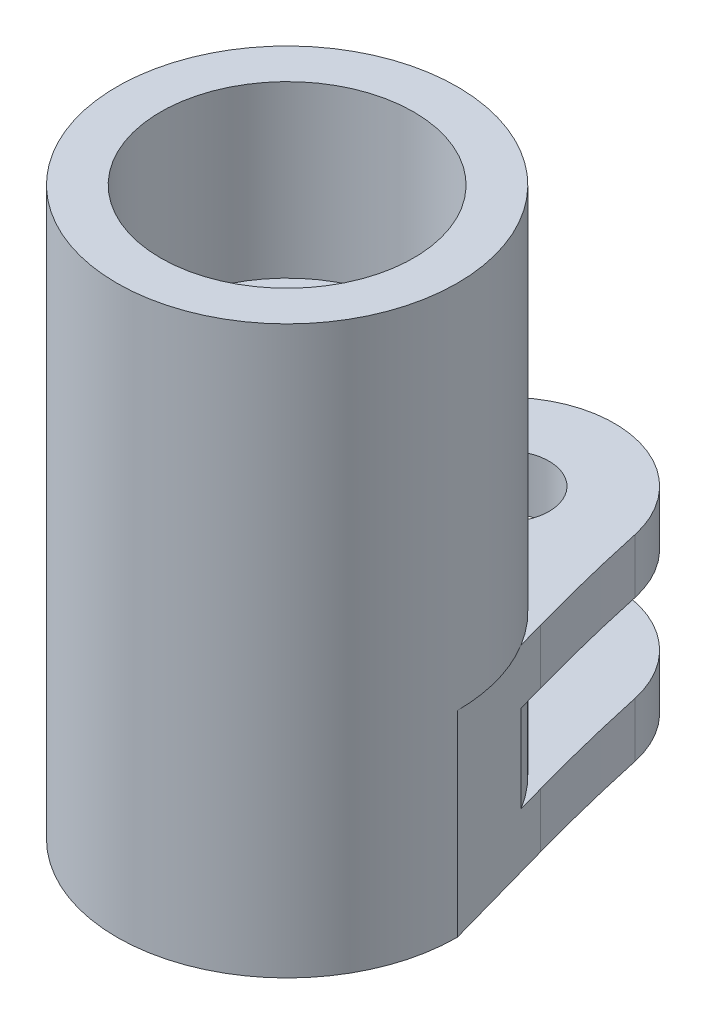
ISO-10303-21;
HEADER;
FILE_DESCRIPTION(('STEP AP214'),'2;1');
FILE_NAME('part.step','',(''),(''),'','','');
FILE_SCHEMA(('AUTOMOTIVE_DESIGN { 1 0 10303 214 1 1 1 1 }'));
ENDSEC;
DATA;
#1=APPLICATION_CONTEXT('core data for automotive mechanical design processes');
#2=APPLICATION_PROTOCOL_DEFINITION('international standard','automotive_design',2000,#1);
#3=PRODUCT_CONTEXT('',#1,'mechanical');
#4=PRODUCT('Part','Part','',(#3));
#5=PRODUCT_RELATED_PRODUCT_CATEGORY('part','',(#4));
#6=PRODUCT_DEFINITION_FORMATION('','',#4);
#7=PRODUCT_DEFINITION_CONTEXT('part definition',#1,'design');
#8=PRODUCT_DEFINITION('design','',#6,#7);
#9=PRODUCT_DEFINITION_SHAPE('','',#8);
#10=(LENGTH_UNIT() NAMED_UNIT(*) SI_UNIT(.MILLI.,.METRE.));
#11=(NAMED_UNIT(*) PLANE_ANGLE_UNIT() SI_UNIT($,.RADIAN.));
#12=(NAMED_UNIT(*) SI_UNIT($,.STERADIAN.) SOLID_ANGLE_UNIT());
#13=UNCERTAINTY_MEASURE_WITH_UNIT(LENGTH_MEASURE(1.E-05),#10,'distance_accuracy_value','');
#14=(GEOMETRIC_REPRESENTATION_CONTEXT(3) GLOBAL_UNCERTAINTY_ASSIGNED_CONTEXT((#13)) GLOBAL_UNIT_ASSIGNED_CONTEXT((#10,
#11,#12)) REPRESENTATION_CONTEXT('',''));
#15=CARTESIAN_POINT('',(0.,0.,0.));
#16=DIRECTION('',(0.,0.,1.));
#17=DIRECTION('',(1.,0.,0.));
#18=AXIS2_PLACEMENT_3D('',#15,#16,#17);
#19=CARTESIAN_POINT('',(0.,0.,0.));
#20=DIRECTION('',(0.,1.,0.));
#21=DIRECTION('',(0.,0.,1.));
#22=AXIS2_PLACEMENT_3D('',#19,#20,#21);
#23=CYLINDRICAL_SURFACE('',#22,2.9);
#24=CARTESIAN_POINT('',(0.,12.98,0.));
#25=DIRECTION('',(0.,1.,0.));
#26=DIRECTION('',(0.,0.,1.));
#27=AXIS2_PLACEMENT_3D('',#24,#25,#26);
#28=CIRCLE('',#27,2.9);
#29=CARTESIAN_POINT('',(0.,12.98,2.9));
#30=VERTEX_POINT('',#29);
#31=EDGE_CURVE('E193',#30,#30,#28,.T.);
#32=ORIENTED_EDGE('',*,*,#31,.T.);
#33=EDGE_LOOP('',(#32));
#34=FACE_BOUND('',#33,.T.);
#35=CARTESIAN_POINT('',(0.,9.08,0.));
#36=DIRECTION('',(0.,-1.,0.));
#37=DIRECTION('',(0.,0.,-1.));
#38=AXIS2_PLACEMENT_3D('',#35,#36,#37);
#39=CIRCLE('',#38,2.9);
#40=CARTESIAN_POINT('',(0.,9.08,-2.9));
#41=VERTEX_POINT('',#40);
#42=EDGE_CURVE('E260',#41,#41,#39,.F.);
#43=ORIENTED_EDGE('',*,*,#42,.F.);
#44=EDGE_LOOP('',(#43));
#45=FACE_BOUND('',#44,.T.);
#46=ADVANCED_FACE('F43',(#34,#45),#23,.F.);
#47=CARTESIAN_POINT('',(2.5,4.5,-5.));
#48=DIRECTION('',(-0.962964019714182,0.,0.269629925519971));
#49=DIRECTION('',(0.269629925519971,0.,0.962964019714182));
#50=AXIS2_PLACEMENT_3D('',#47,#48,#49);
#51=PLANE('',#50);
#52=DIRECTION('',(-0.269629925519971,0.,-0.962964019714182));
#53=VECTOR('',#52,1.);
#54=CARTESIAN_POINT('',(3.33293768545994,3.25,-2.02522255192878));
#55=LINE('',#54,#53);
#56=CARTESIAN_POINT('',(3.33293768545994,3.25,-2.02522255192878));
#57=VERTEX_POINT('',#56);
#58=CARTESIAN_POINT('',(3.15858551307872,3.25,-2.64790888186171));
#59=VERTEX_POINT('',#58);
#60=EDGE_CURVE('E180',#57,#59,#55,.T.);
#61=ORIENTED_EDGE('',*,*,#60,.T.);
#62=DIRECTION('',(0.,1.,0.));
#63=VECTOR('',#62,1.);
#64=CARTESIAN_POINT('',(3.15858551307872,4.5,-2.64790888186171));
#65=LINE('',#64,#63);
#66=CARTESIAN_POINT('',(3.15858551307872,4.5,-2.64790888186171));
#67=VERTEX_POINT('',#66);
#68=EDGE_CURVE('E273',#59,#67,#65,.T.);
#69=ORIENTED_EDGE('',*,*,#68,.T.);
#70=DIRECTION('',(-0.269629925519971,0.,-0.962964019714182));
#71=VECTOR('',#70,1.);
#72=CARTESIAN_POINT('',(2.5,4.5,-5.));
#73=LINE('',#72,#71);
#74=CARTESIAN_POINT('',(3.33293768545994,4.5,-2.02522255192878));
#75=VERTEX_POINT('',#74);
#76=EDGE_CURVE('E226',#75,#67,#73,.T.);
#77=ORIENTED_EDGE('',*,*,#76,.F.);
#78=CARTESIAN_POINT('',(3.9,4.5,0.));
#79=VERTEX_POINT('',#78);
#80=EDGE_CURVE('E221',#79,#75,#73,.T.);
#81=ORIENTED_EDGE('',*,*,#80,.F.);
#82=DIRECTION('',(0.,-1.,0.));
#83=VECTOR('',#82,1.);
#84=CARTESIAN_POINT('',(3.9,4.5,0.));
#85=LINE('',#84,#83);
#86=CARTESIAN_POINT('',(3.9,0.,0.));
#87=VERTEX_POINT('',#86);
#88=EDGE_CURVE('E250',#79,#87,#85,.T.);
#89=ORIENTED_EDGE('',*,*,#88,.T.);
#90=DIRECTION('',(-0.269629925519971,0.,-0.962964019714182));
#91=VECTOR('',#90,1.);
#92=CARTESIAN_POINT('',(2.5,0.,-5.));
#93=LINE('',#92,#91);
#94=CARTESIAN_POINT('',(3.15858551307872,0.,-2.64790888186171));
#95=VERTEX_POINT('',#94);
#96=EDGE_CURVE('E237',#87,#95,#93,.T.);
#97=ORIENTED_EDGE('',*,*,#96,.T.);
#98=DIRECTION('',(0.,1.,0.));
#99=VECTOR('',#98,1.);
#100=CARTESIAN_POINT('',(3.15858551307872,1.25,-2.64790888186171));
#101=LINE('',#100,#99);
#102=CARTESIAN_POINT('',(3.15858551307872,1.25,-2.64790888186171));
#103=VERTEX_POINT('',#102);
#104=EDGE_CURVE('E167',#95,#103,#101,.T.);
#105=ORIENTED_EDGE('',*,*,#104,.T.);
#106=DIRECTION('',(-0.269629925519971,0.,-0.962964019714182));
#107=VECTOR('',#106,1.);
#108=CARTESIAN_POINT('',(3.33293768545994,1.25,-2.02522255192878));
#109=LINE('',#108,#107);
#110=CARTESIAN_POINT('',(3.33293768545994,1.25,-2.02522255192878));
#111=VERTEX_POINT('',#110);
#112=EDGE_CURVE('E158',#111,#103,#109,.T.);
#113=ORIENTED_EDGE('',*,*,#112,.F.);
#114=DIRECTION('',(0.,1.,0.));
#115=VECTOR('',#114,1.);
#116=CARTESIAN_POINT('',(3.33293768545994,1.25,-2.02522255192878));
#117=LINE('',#116,#115);
#118=EDGE_CURVE('E139',#111,#57,#117,.T.);
#119=ORIENTED_EDGE('',*,*,#118,.T.);
#120=EDGE_LOOP('',(#61,#69,#77,#81,#89,#97,#105,#113,#119));
#121=FACE_BOUND('',#120,.T.);
#122=ADVANCED_FACE('F164',(#121),#51,.F.);
#123=CARTESIAN_POINT('',(0.,4.5,-5.));
#124=DIRECTION('',(0.,-1.,0.));
#125=DIRECTION('',(0.,0.,-1.));
#126=AXIS2_PLACEMENT_3D('',#123,#124,#125);
#127=CYLINDRICAL_SURFACE('',#126,2.5);
#128=CARTESIAN_POINT('',(0.,1.25,-5.));
#129=DIRECTION('',(0.,1.,0.));
#130=DIRECTION('',(0.,0.,1.));
#131=AXIS2_PLACEMENT_3D('',#128,#129,#130);
#132=CIRCLE('',#131,2.5);
#133=CARTESIAN_POINT('',(2.44318030946609,1.25,-5.52997167418382));
#134=VERTEX_POINT('',#133);
#135=CARTESIAN_POINT('',(-2.44318030946609,1.25,-5.52997167418382));
#136=VERTEX_POINT('',#135);
#137=EDGE_CURVE('E169',#134,#136,#132,.T.);
#138=ORIENTED_EDGE('',*,*,#137,.F.);
#139=DIRECTION('',(0.,-1.,0.));
#140=VECTOR('',#139,1.);
#141=CARTESIAN_POINT('',(2.44318030946609,4.5,-5.52997167418382));
#142=LINE('',#141,#140);
#143=CARTESIAN_POINT('',(2.44318030946609,0.,-5.52997167418382));
#144=VERTEX_POINT('',#143);
#145=EDGE_CURVE('E279',#134,#144,#142,.T.);
#146=ORIENTED_EDGE('',*,*,#145,.T.);
#147=CARTESIAN_POINT('',(0.,0.,-5.));
#148=DIRECTION('',(0.,1.,0.));
#149=DIRECTION('',(0.,0.,1.));
#150=AXIS2_PLACEMENT_3D('',#147,#148,#149);
#151=CIRCLE('',#150,2.5);
#152=CARTESIAN_POINT('',(-2.44318030946609,0.,-5.52997167418382));
#153=VERTEX_POINT('',#152);
#154=EDGE_CURVE('E240',#144,#153,#151,.T.);
#155=ORIENTED_EDGE('',*,*,#154,.T.);
#156=DIRECTION('',(0.,-1.,0.));
#157=VECTOR('',#156,1.);
#158=CARTESIAN_POINT('',(-2.44318030946609,4.5,-5.52997167418382));
#159=LINE('',#158,#157);
#160=EDGE_CURVE('E276',#153,#136,#159,.F.);
#161=ORIENTED_EDGE('',*,*,#160,.T.);
#162=EDGE_LOOP('',(#138,#146,#155,#161));
#163=FACE_BOUND('',#162,.T.);
#164=ADVANCED_FACE('F347',(#163),#127,.T.);
#165=CARTESIAN_POINT('',(-3.9,4.5,0.));
#166=DIRECTION('',(0.962964019714182,0.,0.269629925519971));
#167=DIRECTION('',(0.269629925519971,0.,-0.962964019714182));
#168=AXIS2_PLACEMENT_3D('',#165,#166,#167);
#169=PLANE('',#168);
#170=DIRECTION('',(-0.269629925519971,0.,0.962964019714182));
#171=VECTOR('',#170,1.);
#172=CARTESIAN_POINT('',(-2.5,1.25,-5.));
#173=LINE('',#172,#171);
#174=CARTESIAN_POINT('',(-3.15858551307872,1.25,-2.64790888186171));
#175=VERTEX_POINT('',#174);
#176=CARTESIAN_POINT('',(-3.33293768545994,1.25,-2.02522255192879));
#177=VERTEX_POINT('',#176);
#178=EDGE_CURVE('E152',#175,#177,#173,.T.);
#179=ORIENTED_EDGE('',*,*,#178,.F.);
#180=DIRECTION('',(0.,1.,0.));
#181=VECTOR('',#180,1.);
#182=CARTESIAN_POINT('',(-3.15858551307872,0.,-2.64790888186171));
#183=LINE('',#182,#181);
#184=CARTESIAN_POINT('',(-3.15858551307872,0.,-2.64790888186171));
#185=VERTEX_POINT('',#184);
#186=EDGE_CURVE('E286',#175,#185,#183,.F.);
#187=ORIENTED_EDGE('',*,*,#186,.T.);
#188=DIRECTION('',(-0.269629925519971,0.,0.962964019714182));
#189=VECTOR('',#188,1.);
#190=CARTESIAN_POINT('',(-3.9,0.,0.));
#191=LINE('',#190,#189);
#192=CARTESIAN_POINT('',(-3.9,0.,0.));
#193=VERTEX_POINT('',#192);
#194=EDGE_CURVE('E244',#185,#193,#191,.T.);
#195=ORIENTED_EDGE('',*,*,#194,.T.);
#196=DIRECTION('',(0.,-1.,0.));
#197=VECTOR('',#196,1.);
#198=CARTESIAN_POINT('',(-3.9,4.5,0.));
#199=LINE('',#198,#197);
#200=CARTESIAN_POINT('',(-3.9,4.5,0.));
#201=VERTEX_POINT('',#200);
#202=EDGE_CURVE('E233',#201,#193,#199,.T.);
#203=ORIENTED_EDGE('',*,*,#202,.F.);
#204=DIRECTION('',(-0.269629925519971,0.,0.962964019714182));
#205=VECTOR('',#204,1.);
#206=CARTESIAN_POINT('',(-3.9,4.5,0.));
#207=LINE('',#206,#205);
#208=CARTESIAN_POINT('',(-3.33293768545994,4.5,-2.02522255192879));
#209=VERTEX_POINT('',#208);
#210=EDGE_CURVE('E229',#209,#201,#207,.T.);
#211=ORIENTED_EDGE('',*,*,#210,.F.);
#212=CARTESIAN_POINT('',(-3.15858551307872,4.5,-2.64790888186171));
#213=VERTEX_POINT('',#212);
#214=EDGE_CURVE('E230',#213,#209,#207,.T.);
#215=ORIENTED_EDGE('',*,*,#214,.F.);
#216=DIRECTION('',(0.,1.,0.));
#217=VECTOR('',#216,1.);
#218=CARTESIAN_POINT('',(-3.15858551307872,3.25,-2.64790888186171));
#219=LINE('',#218,#217);
#220=CARTESIAN_POINT('',(-3.15858551307872,3.25,-2.64790888186171));
#221=VERTEX_POINT('',#220);
#222=EDGE_CURVE('E283',#213,#221,#219,.F.);
#223=ORIENTED_EDGE('',*,*,#222,.T.);
#224=DIRECTION('',(-0.269629925519971,0.,0.962964019714182));
#225=VECTOR('',#224,1.);
#226=CARTESIAN_POINT('',(-2.5,3.25,-5.));
#227=LINE('',#226,#225);
#228=CARTESIAN_POINT('',(-3.33293768545994,3.25,-2.02522255192878));
#229=VERTEX_POINT('',#228);
#230=EDGE_CURVE('E162',#221,#229,#227,.T.);
#231=ORIENTED_EDGE('',*,*,#230,.T.);
#232=DIRECTION('',(0.,1.,0.));
#233=VECTOR('',#232,1.);
#234=CARTESIAN_POINT('',(-3.33293768545994,1.25,-2.02522255192879));
#235=LINE('',#234,#233);
#236=EDGE_CURVE('E151',#177,#229,#235,.T.);
#237=ORIENTED_EDGE('',*,*,#236,.F.);
#238=EDGE_LOOP('',(#179,#187,#195,#203,#211,#215,#223,#231,#237));
#239=FACE_BOUND('',#238,.T.);
#240=ADVANCED_FACE('F318',(#239),#169,.F.);
#241=CARTESIAN_POINT('',(0.,0.,-5.));
#242=DIRECTION('',(0.,1.,0.));
#243=DIRECTION('',(0.,0.,1.));
#244=AXIS2_PLACEMENT_3D('',#241,#242,#243);
#245=CYLINDRICAL_SURFACE('',#244,1.);
#246=CARTESIAN_POINT('',(0.,0.,-5.));
#247=DIRECTION('',(0.,1.,0.));
#248=DIRECTION('',(0.,0.,1.));
#249=AXIS2_PLACEMENT_3D('',#246,#247,#248);
#250=CIRCLE('',#249,1.);
#251=CARTESIAN_POINT('',(0.,0.,-4.));
#252=VERTEX_POINT('',#251);
#253=EDGE_CURVE('E207',#252,#252,#250,.T.);
#254=ORIENTED_EDGE('',*,*,#253,.F.);
#255=EDGE_LOOP('',(#254));
#256=FACE_BOUND('',#255,.T.);
#257=CARTESIAN_POINT('',(0.,1.25,-5.));
#258=DIRECTION('',(0.,1.,0.));
#259=DIRECTION('',(0.,0.,1.));
#260=AXIS2_PLACEMENT_3D('',#257,#258,#259);
#261=CIRCLE('',#260,1.);
#262=CARTESIAN_POINT('',(0.,1.25,-4.));
#263=VERTEX_POINT('',#262);
#264=EDGE_CURVE('E198',#263,#263,#261,.F.);
#265=ORIENTED_EDGE('',*,*,#264,.F.);
#266=EDGE_LOOP('',(#265));
#267=FACE_BOUND('',#266,.T.);
#268=ADVANCED_FACE('F366',(#256,#267),#245,.F.);
#269=CARTESIAN_POINT('',(0.,4.5,0.));
#270=DIRECTION('',(0.,-1.,0.));
#271=DIRECTION('',(0.,0.,-1.));
#272=AXIS2_PLACEMENT_3D('',#269,#270,#271);
#273=CYLINDRICAL_SURFACE('',#272,3.9);
#274=CARTESIAN_POINT('',(0.,0.,0.));
#275=DIRECTION('',(0.,1.,0.));
#276=DIRECTION('',(0.,0.,1.));
#277=AXIS2_PLACEMENT_3D('',#274,#275,#276);
#278=CIRCLE('',#277,3.9);
#279=EDGE_CURVE('E213',#193,#87,#278,.T.);
#280=ORIENTED_EDGE('',*,*,#279,.T.);
#281=ORIENTED_EDGE('',*,*,#88,.F.);
#282=CARTESIAN_POINT('',(0.,4.5,0.));
#283=DIRECTION('',(0.,1.,0.));
#284=DIRECTION('',(0.,0.,1.));
#285=AXIS2_PLACEMENT_3D('',#282,#283,#284);
#286=CIRCLE('',#285,3.9);
#287=EDGE_CURVE('E203',#79,#75,#286,.T.);
#288=ORIENTED_EDGE('',*,*,#287,.T.);
#289=EDGE_CURVE('E208',#75,#209,#286,.T.);
#290=ORIENTED_EDGE('',*,*,#289,.T.);
#291=EDGE_CURVE('E202',#209,#201,#286,.T.);
#292=ORIENTED_EDGE('',*,*,#291,.T.);
#293=ORIENTED_EDGE('',*,*,#202,.T.);
#294=EDGE_LOOP('',(#280,#281,#288,#290,#292,#293));
#295=FACE_BOUND('',#294,.T.);
#296=CARTESIAN_POINT('',(0.,12.98,0.));
#297=DIRECTION('',(0.,1.,0.));
#298=DIRECTION('',(0.,0.,1.));
#299=AXIS2_PLACEMENT_3D('',#296,#297,#298);
#300=CIRCLE('',#299,3.9);
#301=CARTESIAN_POINT('',(0.,12.98,3.9));
#302=VERTEX_POINT('',#301);
#303=EDGE_CURVE('E197',#302,#302,#300,.T.);
#304=ORIENTED_EDGE('',*,*,#303,.F.);
#305=EDGE_LOOP('',(#304));
#306=FACE_BOUND('',#305,.T.);
#307=ADVANCED_FACE('F337',(#295,#306),#273,.T.);
#308=CARTESIAN_POINT('',(0.,4.5,-5.));
#309=DIRECTION('',(0.,1.,0.));
#310=DIRECTION('',(0.,0.,1.));
#311=AXIS2_PLACEMENT_3D('',#308,#309,#310);
#312=CIRCLE('',#311,2.5);
#313=CARTESIAN_POINT('',(2.44318030946609,4.5,-5.52997167418382));
#314=VERTEX_POINT('',#313);
#315=CARTESIAN_POINT('',(-2.44318030946609,4.5,-5.52997167418382));
#316=VERTEX_POINT('',#315);
#317=EDGE_CURVE('E225',#314,#316,#312,.T.);
#318=ORIENTED_EDGE('',*,*,#317,.F.);
#319=DIRECTION('',(0.,-1.,0.));
#320=VECTOR('',#319,1.);
#321=CARTESIAN_POINT('',(2.44318030946609,4.5,-5.52997167418382));
#322=LINE('',#321,#320);
#323=CARTESIAN_POINT('',(2.44318030946609,3.25,-5.52997167418382));
#324=VERTEX_POINT('',#323);
#325=EDGE_CURVE('E267',#314,#324,#322,.T.);
#326=ORIENTED_EDGE('',*,*,#325,.T.);
#327=CARTESIAN_POINT('',(0.,3.25,-5.));
#328=DIRECTION('',(0.,1.,0.));
#329=DIRECTION('',(0.,0.,1.));
#330=AXIS2_PLACEMENT_3D('',#327,#328,#329);
#331=CIRCLE('',#330,2.5);
#332=CARTESIAN_POINT('',(-2.44318030946609,3.25,-5.52997167418382));
#333=VERTEX_POINT('',#332);
#334=EDGE_CURVE('E184',#324,#333,#331,.T.);
#335=ORIENTED_EDGE('',*,*,#334,.T.);
#336=DIRECTION('',(0.,-1.,0.));
#337=VECTOR('',#336,1.);
#338=CARTESIAN_POINT('',(-2.44318030946609,4.5,-5.52997167418382));
#339=LINE('',#338,#337);
#340=EDGE_CURVE('E264',#333,#316,#339,.F.);
#341=ORIENTED_EDGE('',*,*,#340,.T.);
#342=EDGE_LOOP('',(#318,#326,#335,#341));
#343=FACE_BOUND('',#342,.T.);
#344=ADVANCED_FACE('F315',(#343),#127,.T.);
#345=CARTESIAN_POINT('',(0.,4.5,0.));
#346=DIRECTION('',(0.,1.,0.));
#347=DIRECTION('',(0.,0.,1.));
#348=AXIS2_PLACEMENT_3D('',#345,#346,#347);
#349=PLANE('',#348);
#350=ORIENTED_EDGE('',*,*,#289,.F.);
#351=ORIENTED_EDGE('',*,*,#76,.T.);
#352=CARTESIAN_POINT('',(51.3067864987878,4.5,-16.1294051578602));
#353=DIRECTION('',(0.,1.,0.));
#354=DIRECTION('',(0.,0.,1.));
#355=AXIS2_PLACEMENT_3D('',#352,#353,#354);
#356=CIRCLE('',#355,50.);
#357=EDGE_CURVE('E293',#67,#314,#356,.F.);
#358=ORIENTED_EDGE('',*,*,#357,.T.);
#359=ORIENTED_EDGE('',*,*,#317,.T.);
#360=CARTESIAN_POINT('',(-51.3067864987878,4.5,-16.1294051578602));
#361=DIRECTION('',(0.,1.,0.));
#362=DIRECTION('',(0.,0.,1.));
#363=AXIS2_PLACEMENT_3D('',#360,#361,#362);
#364=CIRCLE('',#363,50.);
#365=EDGE_CURVE('E11',#316,#213,#364,.F.);
#366=ORIENTED_EDGE('',*,*,#365,.T.);
#367=ORIENTED_EDGE('',*,*,#214,.T.);
#368=EDGE_LOOP('',(#350,#351,#358,#359,#366,#367));
#369=FACE_BOUND('',#368,.T.);
#370=CARTESIAN_POINT('',(0.,4.5,-5.));
#371=DIRECTION('',(0.,1.,0.));
#372=DIRECTION('',(0.,0.,1.));
#373=AXIS2_PLACEMENT_3D('',#370,#371,#372);
#374=CIRCLE('',#373,1.);
#375=CARTESIAN_POINT('',(0.,4.5,-4.));
#376=VERTEX_POINT('',#375);
#377=EDGE_CURVE('E214',#376,#376,#374,.T.);
#378=ORIENTED_EDGE('',*,*,#377,.F.);
#379=EDGE_LOOP('',(#378));
#380=FACE_BOUND('',#379,.T.);
#381=ADVANCED_FACE('F322',(#369,#380),#349,.T.);
#382=CARTESIAN_POINT('',(0.,0.,0.));
#383=DIRECTION('',(0.,1.,0.));
#384=DIRECTION('',(0.,0.,1.));
#385=AXIS2_PLACEMENT_3D('',#382,#383,#384);
#386=PLANE('',#385);
#387=CARTESIAN_POINT('',(0.,0.,0.));
#388=DIRECTION('',(0.,1.,0.));
#389=DIRECTION('',(0.,0.,1.));
#390=AXIS2_PLACEMENT_3D('',#387,#388,#389);
#391=CIRCLE('',#390,2.9);
#392=CARTESIAN_POINT('',(0.,0.,2.9));
#393=VERTEX_POINT('',#392);
#394=EDGE_CURVE('E209',#393,#393,#391,.T.);
#395=ORIENTED_EDGE('',*,*,#394,.T.);
#396=EDGE_LOOP('',(#395));
#397=FACE_BOUND('',#396,.T.);
#398=ORIENTED_EDGE('',*,*,#253,.T.);
#399=EDGE_LOOP('',(#398));
#400=FACE_BOUND('',#399,.T.);
#401=ORIENTED_EDGE('',*,*,#279,.F.);
#402=ORIENTED_EDGE('',*,*,#194,.F.);
#403=CARTESIAN_POINT('',(-51.3067864987878,0.,-16.1294051578602));
#404=DIRECTION('',(0.,1.,0.));
#405=DIRECTION('',(0.,0.,1.));
#406=AXIS2_PLACEMENT_3D('',#403,#404,#405);
#407=CIRCLE('',#406,50.);
#408=EDGE_CURVE('E302',#185,#153,#407,.T.);
#409=ORIENTED_EDGE('',*,*,#408,.T.);
#410=ORIENTED_EDGE('',*,*,#154,.F.);
#411=CARTESIAN_POINT('',(51.3067864987878,0.,-16.1294051578602));
#412=DIRECTION('',(0.,1.,0.));
#413=DIRECTION('',(0.,0.,1.));
#414=AXIS2_PLACEMENT_3D('',#411,#412,#413);
#415=CIRCLE('',#414,50.);
#416=EDGE_CURVE('E296',#144,#95,#415,.T.);
#417=ORIENTED_EDGE('',*,*,#416,.T.);
#418=ORIENTED_EDGE('',*,*,#96,.F.);
#419=EDGE_LOOP('',(#401,#402,#409,#410,#417,#418));
#420=FACE_BOUND('',#419,.T.);
#421=ADVANCED_FACE('F354',(#397,#400,#420),#386,.F.);
#422=CARTESIAN_POINT('',(0.,3.25,-5.));
#423=DIRECTION('',(0.,1.,0.));
#424=DIRECTION('',(0.,0.,1.));
#425=AXIS2_PLACEMENT_3D('',#422,#423,#424);
#426=CIRCLE('',#425,1.);
#427=CARTESIAN_POINT('',(0.,3.25,-4.));
#428=VERTEX_POINT('',#427);
#429=EDGE_CURVE('E191',#428,#428,#426,.F.);
#430=ORIENTED_EDGE('',*,*,#429,.T.);
#431=EDGE_LOOP('',(#430));
#432=FACE_BOUND('',#431,.T.);
#433=ORIENTED_EDGE('',*,*,#377,.T.);
#434=EDGE_LOOP('',(#433));
#435=FACE_BOUND('',#434,.T.);
#436=ADVANCED_FACE('F356',(#432,#435),#245,.F.);
#437=CARTESIAN_POINT('',(0.,8.08,0.));
#438=DIRECTION('',(0.,-1.,0.));
#439=DIRECTION('',(0.,0.,-1.));
#440=AXIS2_PLACEMENT_3D('',#437,#438,#439);
#441=CIRCLE('',#440,2.9);
#442=CARTESIAN_POINT('',(0.,8.08,-2.9));
#443=VERTEX_POINT('',#442);
#444=EDGE_CURVE('E181',#443,#443,#441,.T.);
#445=ORIENTED_EDGE('',*,*,#444,.F.);
#446=EDGE_LOOP('',(#445));
#447=FACE_BOUND('',#446,.T.);
#448=ORIENTED_EDGE('',*,*,#394,.F.);
#449=EDGE_LOOP('',(#448));
#450=FACE_BOUND('',#449,.T.);
#451=ADVANCED_FACE('F363',(#447,#450),#23,.F.);
#452=CARTESIAN_POINT('',(0.,4.5,0.));
#453=DIRECTION('',(0.,1.,0.));
#454=DIRECTION('',(0.,0.,1.));
#455=AXIS2_PLACEMENT_3D('',#452,#453,#454);
#456=PLANE('',#455);
#457=ORIENTED_EDGE('',*,*,#287,.F.);
#458=ORIENTED_EDGE('',*,*,#80,.T.);
#459=EDGE_LOOP('',(#457,#458));
#460=FACE_BOUND('',#459,.T.);
#461=ADVANCED_FACE('F336',(#460),#456,.F.);
#462=ORIENTED_EDGE('',*,*,#291,.F.);
#463=ORIENTED_EDGE('',*,*,#210,.T.);
#464=EDGE_LOOP('',(#462,#463));
#465=FACE_BOUND('',#464,.T.);
#466=ADVANCED_FACE('F384',(#465),#456,.F.);
#467=CARTESIAN_POINT('',(0.,12.98,0.));
#468=DIRECTION('',(0.,1.,0.));
#469=DIRECTION('',(0.,0.,1.));
#470=AXIS2_PLACEMENT_3D('',#467,#468,#469);
#471=PLANE('',#470);
#472=ORIENTED_EDGE('',*,*,#303,.T.);
#473=EDGE_LOOP('',(#472));
#474=FACE_BOUND('',#473,.T.);
#475=ORIENTED_EDGE('',*,*,#31,.F.);
#476=EDGE_LOOP('',(#475));
#477=FACE_BOUND('',#476,.T.);
#478=ADVANCED_FACE('F422',(#474,#477),#471,.T.);
#479=CARTESIAN_POINT('',(0.,1.25,0.));
#480=DIRECTION('',(0.,1.,0.));
#481=DIRECTION('',(0.,0.,1.));
#482=AXIS2_PLACEMENT_3D('',#479,#480,#481);
#483=PLANE('',#482);
#484=CARTESIAN_POINT('',(0.,1.25,0.));
#485=DIRECTION('',(0.,-1.,0.));
#486=DIRECTION('',(0.,0.,1.));
#487=AXIS2_PLACEMENT_3D('',#484,#485,#486);
#488=CIRCLE('',#487,3.9);
#489=EDGE_CURVE('E143',#177,#111,#488,.T.);
#490=ORIENTED_EDGE('',*,*,#489,.T.);
#491=ORIENTED_EDGE('',*,*,#112,.T.);
#492=CARTESIAN_POINT('',(51.3067864987878,1.25,-16.1294051578602));
#493=DIRECTION('',(0.,1.,0.));
#494=DIRECTION('',(0.,0.,1.));
#495=AXIS2_PLACEMENT_3D('',#492,#493,#494);
#496=CIRCLE('',#495,50.);
#497=EDGE_CURVE('E299',#103,#134,#496,.F.);
#498=ORIENTED_EDGE('',*,*,#497,.T.);
#499=ORIENTED_EDGE('',*,*,#137,.T.);
#500=CARTESIAN_POINT('',(-51.3067864987878,1.25,-16.1294051578602));
#501=DIRECTION('',(0.,1.,0.));
#502=DIRECTION('',(0.,0.,1.));
#503=AXIS2_PLACEMENT_3D('',#500,#501,#502);
#504=CIRCLE('',#503,50.);
#505=EDGE_CURVE('E305',#136,#175,#504,.F.);
#506=ORIENTED_EDGE('',*,*,#505,.T.);
#507=ORIENTED_EDGE('',*,*,#178,.T.);
#508=EDGE_LOOP('',(#490,#491,#498,#499,#506,#507));
#509=FACE_BOUND('',#508,.T.);
#510=ORIENTED_EDGE('',*,*,#264,.T.);
#511=EDGE_LOOP('',(#510));
#512=FACE_BOUND('',#511,.T.);
#513=ADVANCED_FACE('F156',(#509,#512),#483,.T.);
#514=CARTESIAN_POINT('',(0.,3.25,0.));
#515=DIRECTION('',(0.,1.,0.));
#516=DIRECTION('',(0.,0.,1.));
#517=AXIS2_PLACEMENT_3D('',#514,#515,#516);
#518=PLANE('',#517);
#519=CARTESIAN_POINT('',(0.,3.25,0.));
#520=DIRECTION('',(0.,-1.,0.));
#521=DIRECTION('',(0.,0.,1.));
#522=AXIS2_PLACEMENT_3D('',#519,#520,#521);
#523=CIRCLE('',#522,3.9);
#524=EDGE_CURVE('E146',#229,#57,#523,.T.);
#525=ORIENTED_EDGE('',*,*,#524,.F.);
#526=ORIENTED_EDGE('',*,*,#230,.F.);
#527=CARTESIAN_POINT('',(-51.3067864987878,3.25,-16.1294051578602));
#528=DIRECTION('',(0.,1.,0.));
#529=DIRECTION('',(0.,0.,1.));
#530=AXIS2_PLACEMENT_3D('',#527,#528,#529);
#531=CIRCLE('',#530,50.);
#532=EDGE_CURVE('E52',#221,#333,#531,.T.);
#533=ORIENTED_EDGE('',*,*,#532,.T.);
#534=ORIENTED_EDGE('',*,*,#334,.F.);
#535=CARTESIAN_POINT('',(51.3067864987878,3.25,-16.1294051578602));
#536=DIRECTION('',(0.,1.,0.));
#537=DIRECTION('',(0.,0.,1.));
#538=AXIS2_PLACEMENT_3D('',#535,#536,#537);
#539=CIRCLE('',#538,50.);
#540=EDGE_CURVE('E290',#324,#59,#539,.T.);
#541=ORIENTED_EDGE('',*,*,#540,.T.);
#542=ORIENTED_EDGE('',*,*,#60,.F.);
#543=EDGE_LOOP('',(#525,#526,#533,#534,#541,#542));
#544=FACE_BOUND('',#543,.T.);
#545=ORIENTED_EDGE('',*,*,#429,.F.);
#546=EDGE_LOOP('',(#545));
#547=FACE_BOUND('',#546,.T.);
#548=ADVANCED_FACE('F311',(#544,#547),#518,.F.);
#549=CARTESIAN_POINT('',(0.,1.25,0.));
#550=DIRECTION('',(0.,1.,0.));
#551=DIRECTION('',(0.,0.,1.));
#552=AXIS2_PLACEMENT_3D('',#549,#550,#551);
#553=CYLINDRICAL_SURFACE('',#552,3.9);
#554=ORIENTED_EDGE('',*,*,#524,.T.);
#555=ORIENTED_EDGE('',*,*,#118,.F.);
#556=ORIENTED_EDGE('',*,*,#489,.F.);
#557=ORIENTED_EDGE('',*,*,#236,.T.);
#558=EDGE_LOOP('',(#554,#555,#556,#557));
#559=FACE_BOUND('',#558,.T.);
#560=ADVANCED_FACE('F141',(#559),#553,.T.);
#561=CARTESIAN_POINT('',(0.,8.08,0.));
#562=DIRECTION('',(0.,-1.,0.));
#563=DIRECTION('',(0.,0.,-1.));
#564=AXIS2_PLACEMENT_3D('',#561,#562,#563);
#565=PLANE('',#564);
#566=ORIENTED_EDGE('',*,*,#444,.T.);
#567=EDGE_LOOP('',(#566));
#568=FACE_BOUND('',#567,.T.);
#569=CARTESIAN_POINT('',(0.,8.08,0.));
#570=DIRECTION('',(0.,-1.,0.));
#571=DIRECTION('',(0.,0.,-1.));
#572=AXIS2_PLACEMENT_3D('',#569,#570,#571);
#573=CIRCLE('',#572,1.5);
#574=CARTESIAN_POINT('',(0.,8.08,-1.5));
#575=VERTEX_POINT('',#574);
#576=EDGE_CURVE('E391',#575,#575,#573,.T.);
#577=ORIENTED_EDGE('',*,*,#576,.F.);
#578=EDGE_LOOP('',(#577));
#579=FACE_BOUND('',#578,.T.);
#580=ADVANCED_FACE('F414',(#568,#579),#565,.T.);
#581=CARTESIAN_POINT('',(0.,9.08,0.));
#582=DIRECTION('',(0.,-1.,0.));
#583=DIRECTION('',(0.,0.,-1.));
#584=AXIS2_PLACEMENT_3D('',#581,#582,#583);
#585=PLANE('',#584);
#586=ORIENTED_EDGE('',*,*,#42,.T.);
#587=EDGE_LOOP('',(#586));
#588=FACE_BOUND('',#587,.T.);
#589=CARTESIAN_POINT('',(0.,9.08,0.));
#590=DIRECTION('',(0.,-1.,0.));
#591=DIRECTION('',(0.,0.,-1.));
#592=AXIS2_PLACEMENT_3D('',#589,#590,#591);
#593=CIRCLE('',#592,1.5);
#594=CARTESIAN_POINT('',(0.,9.08,-1.5));
#595=VERTEX_POINT('',#594);
#596=EDGE_CURVE('E394',#595,#595,#593,.T.);
#597=ORIENTED_EDGE('',*,*,#596,.T.);
#598=EDGE_LOOP('',(#597));
#599=FACE_BOUND('',#598,.T.);
#600=ADVANCED_FACE('F401',(#588,#599),#585,.F.);
#601=CARTESIAN_POINT('',(0.,8.08,0.));
#602=DIRECTION('',(0.,1.,0.));
#603=DIRECTION('',(0.,0.,1.));
#604=AXIS2_PLACEMENT_3D('',#601,#602,#603);
#605=CYLINDRICAL_SURFACE('',#604,1.5);
#606=ORIENTED_EDGE('',*,*,#576,.T.);
#607=EDGE_LOOP('',(#606));
#608=FACE_BOUND('',#607,.T.);
#609=ORIENTED_EDGE('',*,*,#596,.F.);
#610=EDGE_LOOP('',(#609));
#611=FACE_BOUND('',#610,.T.);
#612=ADVANCED_FACE('F403',(#608,#611),#605,.F.);
#613=CARTESIAN_POINT('',(51.3067864987878,4.5,-16.1294051578602));
#614=DIRECTION('',(0.,-1.,0.));
#615=DIRECTION('',(0.,0.,-1.));
#616=AXIS2_PLACEMENT_3D('',#613,#614,#615);
#617=CYLINDRICAL_SURFACE('',#616,50.);
#618=ORIENTED_EDGE('',*,*,#357,.F.);
#619=ORIENTED_EDGE('',*,*,#68,.F.);
#620=ORIENTED_EDGE('',*,*,#540,.F.);
#621=ORIENTED_EDGE('',*,*,#325,.F.);
#622=EDGE_LOOP('',(#618,#619,#620,#621));
#623=FACE_BOUND('',#622,.T.);
#624=ADVANCED_FACE('F405',(#623),#617,.F.);
#625=CARTESIAN_POINT('',(51.3067864987878,4.5,-16.1294051578602));
#626=DIRECTION('',(0.,-1.,0.));
#627=DIRECTION('',(0.,0.,-1.));
#628=AXIS2_PLACEMENT_3D('',#625,#626,#627);
#629=CYLINDRICAL_SURFACE('',#628,50.);
#630=ORIENTED_EDGE('',*,*,#497,.F.);
#631=ORIENTED_EDGE('',*,*,#104,.F.);
#632=ORIENTED_EDGE('',*,*,#416,.F.);
#633=ORIENTED_EDGE('',*,*,#145,.F.);
#634=EDGE_LOOP('',(#630,#631,#632,#633));
#635=FACE_BOUND('',#634,.T.);
#636=ADVANCED_FACE('F342',(#635),#629,.F.);
#637=CARTESIAN_POINT('',(-51.3067864987878,4.5,-16.1294051578602));
#638=DIRECTION('',(0.,-1.,0.));
#639=DIRECTION('',(0.,0.,-1.));
#640=AXIS2_PLACEMENT_3D('',#637,#638,#639);
#641=CYLINDRICAL_SURFACE('',#640,50.);
#642=ORIENTED_EDGE('',*,*,#505,.F.);
#643=ORIENTED_EDGE('',*,*,#160,.F.);
#644=ORIENTED_EDGE('',*,*,#408,.F.);
#645=ORIENTED_EDGE('',*,*,#186,.F.);
#646=EDGE_LOOP('',(#642,#643,#644,#645));
#647=FACE_BOUND('',#646,.T.);
#648=ADVANCED_FACE('F351',(#647),#641,.F.);
#649=CARTESIAN_POINT('',(-51.3067864987878,4.5,-16.1294051578602));
#650=DIRECTION('',(0.,-1.,0.));
#651=DIRECTION('',(0.,0.,-1.));
#652=AXIS2_PLACEMENT_3D('',#649,#650,#651);
#653=CYLINDRICAL_SURFACE('',#652,50.);
#654=ORIENTED_EDGE('',*,*,#365,.F.);
#655=ORIENTED_EDGE('',*,*,#340,.F.);
#656=ORIENTED_EDGE('',*,*,#532,.F.);
#657=ORIENTED_EDGE('',*,*,#222,.F.);
#658=EDGE_LOOP('',(#654,#655,#656,#657));
#659=FACE_BOUND('',#658,.T.);
#660=ADVANCED_FACE('F45',(#659),#653,.F.);
#661=CLOSED_SHELL('',(#46,#122,#164,#240,#268,#307,#344,#381,#421,#436,#451,#461,#466,#478,#513,
#548,#560,#580,#600,#612,#624,#636,#648,#660));
#662=MANIFOLD_SOLID_BREP('B2',#661);
#663=ADVANCED_BREP_SHAPE_REPRESENTATION('',(#18,#662),#14);
#664=SHAPE_DEFINITION_REPRESENTATION(#9,#663);
ENDSEC;
END-ISO-10303-21;
